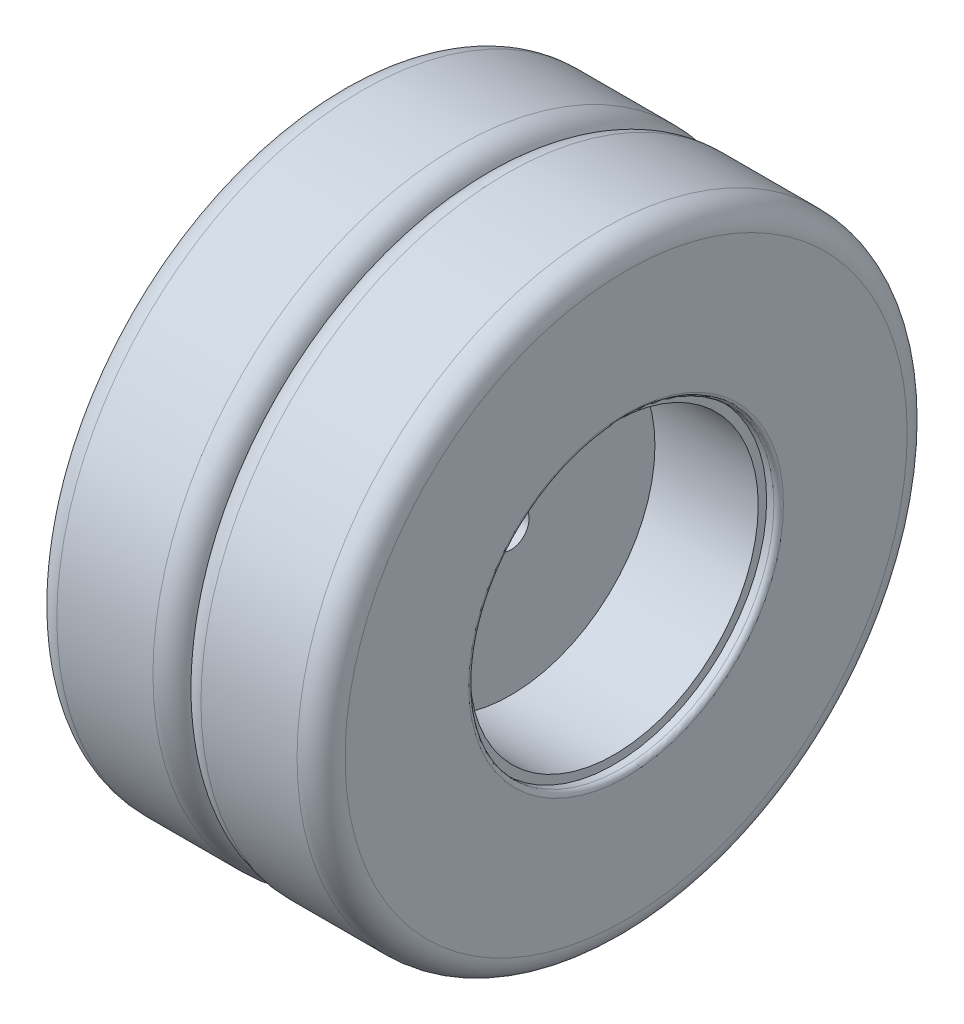
ISO-10303-21;
HEADER;
FILE_DESCRIPTION(('STEP AP214'),'2;1');
FILE_NAME('part.step','',(''),(''),'','','');
FILE_SCHEMA(('AUTOMOTIVE_DESIGN { 1 0 10303 214 1 1 1 1 }'));
ENDSEC;
DATA;
#1=APPLICATION_CONTEXT('core data for automotive mechanical design processes');
#2=APPLICATION_PROTOCOL_DEFINITION('international standard','automotive_design',2000,#1);
#3=PRODUCT_CONTEXT('',#1,'mechanical');
#4=PRODUCT('Part','Part','',(#3));
#5=PRODUCT_RELATED_PRODUCT_CATEGORY('part','',(#4));
#6=PRODUCT_DEFINITION_FORMATION('','',#4);
#7=PRODUCT_DEFINITION_CONTEXT('part definition',#1,'design');
#8=PRODUCT_DEFINITION('design','',#6,#7);
#9=PRODUCT_DEFINITION_SHAPE('','',#8);
#10=(LENGTH_UNIT() NAMED_UNIT(*) SI_UNIT(.MILLI.,.METRE.));
#11=(NAMED_UNIT(*) PLANE_ANGLE_UNIT() SI_UNIT($,.RADIAN.));
#12=(NAMED_UNIT(*) SI_UNIT($,.STERADIAN.) SOLID_ANGLE_UNIT());
#13=UNCERTAINTY_MEASURE_WITH_UNIT(LENGTH_MEASURE(1.E-05),#10,'distance_accuracy_value','');
#14=(GEOMETRIC_REPRESENTATION_CONTEXT(3) GLOBAL_UNCERTAINTY_ASSIGNED_CONTEXT((#13)) GLOBAL_UNIT_ASSIGNED_CONTEXT((#10,
#11,#12)) REPRESENTATION_CONTEXT('',''));
#15=CARTESIAN_POINT('',(0.,0.,0.));
#16=DIRECTION('',(0.,0.,1.));
#17=DIRECTION('',(1.,0.,0.));
#18=AXIS2_PLACEMENT_3D('',#15,#16,#17);
#19=CARTESIAN_POINT('',(-12.,0.,0.));
#20=DIRECTION('',(-1.,0.,0.));
#21=DIRECTION('',(0.,0.,-1.));
#22=AXIS2_PLACEMENT_3D('',#19,#20,#21);
#23=PLANE('',#22);
#24=CARTESIAN_POINT('',(-12.,0.,0.));
#25=DIRECTION('',(1.,0.,0.));
#26=DIRECTION('',(0.,0.,-1.));
#27=AXIS2_PLACEMENT_3D('',#24,#25,#26);
#28=CIRCLE('',#27,7.625);
#29=CARTESIAN_POINT('',(-12.,0.,-7.625));
#30=VERTEX_POINT('',#29);
#31=EDGE_CURVE('E83',#30,#30,#28,.T.);
#32=ORIENTED_EDGE('',*,*,#31,.T.);
#33=EDGE_LOOP('',(#32));
#34=FACE_BOUND('',#33,.T.);
#35=CARTESIAN_POINT('',(-12.,0.,0.));
#36=DIRECTION('',(1.,0.,0.));
#37=DIRECTION('',(0.,0.,-1.));
#38=AXIS2_PLACEMENT_3D('',#35,#36,#37);
#39=CIRCLE('',#38,60.);
#40=CARTESIAN_POINT('',(-12.,0.,-60.));
#41=VERTEX_POINT('',#40);
#42=EDGE_CURVE('E79',#41,#41,#39,.F.);
#43=ORIENTED_EDGE('',*,*,#42,.T.);
#44=EDGE_LOOP('',(#43));
#45=FACE_BOUND('',#44,.T.);
#46=ADVANCED_FACE('F47',(#34,#45),#23,.T.);
#47=CARTESIAN_POINT('',(-5.,0.,0.));
#48=DIRECTION('',(-1.,0.,0.));
#49=DIRECTION('',(0.,0.,-1.));
#50=AXIS2_PLACEMENT_3D('',#47,#48,#49);
#51=PLANE('',#50);
#52=CARTESIAN_POINT('',(-5.,0.,0.));
#53=DIRECTION('',(1.,0.,0.));
#54=DIRECTION('',(0.,0.,-1.));
#55=AXIS2_PLACEMENT_3D('',#52,#53,#54);
#56=CIRCLE('',#55,63.5);
#57=CARTESIAN_POINT('',(-5.,0.,-63.5));
#58=VERTEX_POINT('',#57);
#59=EDGE_CURVE('E80',#58,#58,#56,.T.);
#60=ORIENTED_EDGE('',*,*,#59,.T.);
#61=EDGE_LOOP('',(#60));
#62=FACE_BOUND('',#61,.T.);
#63=CARTESIAN_POINT('',(-5.,0.,0.));
#64=DIRECTION('',(1.,0.,0.));
#65=DIRECTION('',(0.,0.,-1.));
#66=AXIS2_PLACEMENT_3D('',#63,#64,#65);
#67=CIRCLE('',#66,7.625);
#68=CARTESIAN_POINT('',(-5.,0.,-7.625));
#69=VERTEX_POINT('',#68);
#70=EDGE_CURVE('E84',#69,#69,#67,.T.);
#71=ORIENTED_EDGE('',*,*,#70,.F.);
#72=EDGE_LOOP('',(#71));
#73=FACE_BOUND('',#72,.T.);
#74=ADVANCED_FACE('F124',(#62,#73),#51,.F.);
#75=CARTESIAN_POINT('',(-12.,0.,0.));
#76=DIRECTION('',(1.,0.,0.));
#77=DIRECTION('',(0.,0.,1.));
#78=AXIS2_PLACEMENT_3D('',#75,#76,#77);
#79=CYLINDRICAL_SURFACE('',#78,7.625);
#80=ORIENTED_EDGE('',*,*,#31,.F.);
#81=EDGE_LOOP('',(#80));
#82=FACE_BOUND('',#81,.T.);
#83=ORIENTED_EDGE('',*,*,#70,.T.);
#84=EDGE_LOOP('',(#83));
#85=FACE_BOUND('',#84,.T.);
#86=ADVANCED_FACE('F130',(#82,#85),#79,.F.);
#87=CARTESIAN_POINT('',(-55.,0.,0.));
#88=DIRECTION('',(-1.,0.,0.));
#89=DIRECTION('',(0.,0.,-1.));
#90=AXIS2_PLACEMENT_3D('',#87,#88,#89);
#91=PLANE('',#90);
#92=CARTESIAN_POINT('',(-55.,0.,0.));
#93=DIRECTION('',(1.,0.,0.));
#94=DIRECTION('',(0.,0.,-1.));
#95=AXIS2_PLACEMENT_3D('',#92,#93,#94);
#96=CIRCLE('',#95,63.5);
#97=CARTESIAN_POINT('',(-55.,0.,-63.5));
#98=VERTEX_POINT('',#97);
#99=EDGE_CURVE('E94',#98,#98,#96,.F.);
#100=ORIENTED_EDGE('',*,*,#99,.T.);
#101=EDGE_LOOP('',(#100));
#102=FACE_BOUND('',#101,.T.);
#103=CARTESIAN_POINT('',(-55.,0.,0.));
#104=DIRECTION('',(1.,0.,0.));
#105=DIRECTION('',(0.,0.,-1.));
#106=AXIS2_PLACEMENT_3D('',#103,#104,#105);
#107=CIRCLE('',#106,60.);
#108=CARTESIAN_POINT('',(-55.,0.,-60.));
#109=VERTEX_POINT('',#108);
#110=EDGE_CURVE('E87',#109,#109,#107,.T.);
#111=ORIENTED_EDGE('',*,*,#110,.T.);
#112=EDGE_LOOP('',(#111));
#113=FACE_BOUND('',#112,.T.);
#114=ADVANCED_FACE('F98',(#102,#113),#91,.T.);
#115=CARTESIAN_POINT('',(-55.,0.,0.));
#116=DIRECTION('',(1.,0.,0.));
#117=DIRECTION('',(0.,0.,1.));
#118=AXIS2_PLACEMENT_3D('',#115,#116,#117);
#119=CYLINDRICAL_SURFACE('',#118,60.);
#120=ORIENTED_EDGE('',*,*,#42,.F.);
#121=EDGE_LOOP('',(#120));
#122=FACE_BOUND('',#121,.T.);
#123=ORIENTED_EDGE('',*,*,#110,.F.);
#124=EDGE_LOOP('',(#123));
#125=FACE_BOUND('',#124,.T.);
#126=ADVANCED_FACE('F121',(#122,#125),#119,.F.);
#127=CARTESIAN_POINT('',(-60.,0.,0.));
#128=DIRECTION('',(1.,0.,0.));
#129=DIRECTION('',(0.,0.,1.));
#130=AXIS2_PLACEMENT_3D('',#127,#128,#129);
#131=CYLINDRICAL_SURFACE('',#130,63.5);
#132=CARTESIAN_POINT('',(-2.,0.,0.));
#133=DIRECTION('',(1.,0.,0.));
#134=DIRECTION('',(0.,0.,-1.));
#135=AXIS2_PLACEMENT_3D('',#132,#133,#134);
#136=CIRCLE('',#135,63.5);
#137=CARTESIAN_POINT('',(-2.,0.,-63.5));
#138=VERTEX_POINT('',#137);
#139=EDGE_CURVE('E58',#138,#138,#136,.F.);
#140=ORIENTED_EDGE('',*,*,#139,.F.);
#141=EDGE_LOOP('',(#140));
#142=FACE_BOUND('',#141,.T.);
#143=ORIENTED_EDGE('',*,*,#59,.F.);
#144=EDGE_LOOP('',(#143));
#145=FACE_BOUND('',#144,.T.);
#146=ADVANCED_FACE('F107',(#142,#145),#131,.F.);
#147=CARTESIAN_POINT('',(-60.,0.,0.));
#148=DIRECTION('',(-1.,0.,0.));
#149=DIRECTION('',(0.,0.,-1.));
#150=AXIS2_PLACEMENT_3D('',#147,#148,#149);
#151=PLANE('',#150);
#152=CARTESIAN_POINT('',(-60.,0.,0.));
#153=DIRECTION('',(1.,0.,0.));
#154=DIRECTION('',(0.,0.,-1.));
#155=AXIS2_PLACEMENT_3D('',#152,#153,#154);
#156=CIRCLE('',#155,65.5);
#157=CARTESIAN_POINT('',(-60.,0.,-65.5));
#158=VERTEX_POINT('',#157);
#159=EDGE_CURVE('E11',#158,#158,#156,.F.);
#160=ORIENTED_EDGE('',*,*,#159,.F.);
#161=EDGE_LOOP('',(#160));
#162=FACE_BOUND('',#161,.T.);
#163=CARTESIAN_POINT('',(-60.,0.,0.));
#164=DIRECTION('',(1.,0.,0.));
#165=DIRECTION('',(0.,0.,-1.));
#166=AXIS2_PLACEMENT_3D('',#163,#164,#165);
#167=CIRCLE('',#166,117.);
#168=CARTESIAN_POINT('',(-60.,0.,-117.));
#169=VERTEX_POINT('',#168);
#170=EDGE_CURVE('E67',#169,#169,#167,.T.);
#171=ORIENTED_EDGE('',*,*,#170,.F.);
#172=EDGE_LOOP('',(#171));
#173=FACE_BOUND('',#172,.T.);
#174=ADVANCED_FACE('F120',(#162,#173),#151,.T.);
#175=CARTESIAN_POINT('',(0.,0.,0.));
#176=DIRECTION('',(-1.,0.,0.));
#177=DIRECTION('',(0.,0.,-1.));
#178=AXIS2_PLACEMENT_3D('',#175,#176,#177);
#179=PLANE('',#178);
#180=CARTESIAN_POINT('',(0.,0.,0.));
#181=DIRECTION('',(1.,0.,0.));
#182=DIRECTION('',(0.,0.,-1.));
#183=AXIS2_PLACEMENT_3D('',#180,#181,#182);
#184=CIRCLE('',#183,65.5);
#185=CARTESIAN_POINT('',(0.,0.,-65.5));
#186=VERTEX_POINT('',#185);
#187=EDGE_CURVE('E62',#186,#186,#184,.T.);
#188=ORIENTED_EDGE('',*,*,#187,.F.);
#189=EDGE_LOOP('',(#188));
#190=FACE_BOUND('',#189,.T.);
#191=CARTESIAN_POINT('',(0.,0.,0.));
#192=DIRECTION('',(1.,0.,0.));
#193=DIRECTION('',(0.,0.,-1.));
#194=AXIS2_PLACEMENT_3D('',#191,#192,#193);
#195=CIRCLE('',#194,117.);
#196=CARTESIAN_POINT('',(0.,0.,-117.));
#197=VERTEX_POINT('',#196);
#198=EDGE_CURVE('E70',#197,#197,#195,.F.);
#199=ORIENTED_EDGE('',*,*,#198,.F.);
#200=EDGE_LOOP('',(#199));
#201=FACE_BOUND('',#200,.T.);
#202=ADVANCED_FACE('F115',(#190,#201),#179,.F.);
#203=CARTESIAN_POINT('',(-60.,0.,0.));
#204=DIRECTION('',(1.,0.,0.));
#205=DIRECTION('',(0.,0.,1.));
#206=AXIS2_PLACEMENT_3D('',#203,#204,#205);
#207=CYLINDRICAL_SURFACE('',#206,127.);
#208=CARTESIAN_POINT('',(-10.,0.,0.));
#209=DIRECTION('',(1.,0.,0.));
#210=DIRECTION('',(0.,0.,-1.));
#211=AXIS2_PLACEMENT_3D('',#208,#209,#210);
#212=CIRCLE('',#211,127.);
#213=CARTESIAN_POINT('',(-10.,0.,-127.));
#214=VERTEX_POINT('',#213);
#215=EDGE_CURVE('E73',#214,#214,#212,.T.);
#216=ORIENTED_EDGE('',*,*,#215,.F.);
#217=EDGE_LOOP('',(#216));
#218=FACE_BOUND('',#217,.T.);
#219=CARTESIAN_POINT('',(-50.,0.,0.));
#220=DIRECTION('',(1.,0.,0.));
#221=DIRECTION('',(0.,0.,-1.));
#222=AXIS2_PLACEMENT_3D('',#219,#220,#221);
#223=CIRCLE('',#222,127.);
#224=CARTESIAN_POINT('',(-50.,0.,-127.));
#225=VERTEX_POINT('',#224);
#226=EDGE_CURVE('E76',#225,#225,#223,.F.);
#227=ORIENTED_EDGE('',*,*,#226,.F.);
#228=EDGE_LOOP('',(#227));
#229=FACE_BOUND('',#228,.T.);
#230=ADVANCED_FACE('F104',(#218,#229),#207,.T.);
#231=CARTESIAN_POINT('',(-58.,0.,0.));
#232=DIRECTION('',(1.,0.,0.));
#233=DIRECTION('',(0.,0.,-1.));
#234=AXIS2_PLACEMENT_3D('',#231,#232,#233);
#235=CIRCLE('',#234,63.5);
#236=CARTESIAN_POINT('',(-58.,0.,-63.5));
#237=VERTEX_POINT('',#236);
#238=EDGE_CURVE('E54',#237,#237,#235,.T.);
#239=ORIENTED_EDGE('',*,*,#238,.F.);
#240=EDGE_LOOP('',(#239));
#241=FACE_BOUND('',#240,.T.);
#242=ORIENTED_EDGE('',*,*,#99,.F.);
#243=EDGE_LOOP('',(#242));
#244=FACE_BOUND('',#243,.T.);
#245=ADVANCED_FACE('F101',(#241,#244),#131,.F.);
#246=CARTESIAN_POINT('',(-10.,0.,0.));
#247=DIRECTION('',(-1.,0.,0.));
#248=DIRECTION('',(0.,0.,-1.));
#249=AXIS2_PLACEMENT_3D('',#246,#247,#248);
#250=TOROIDAL_SURFACE('',#249,117.,10.);
#251=ORIENTED_EDGE('',*,*,#198,.T.);
#252=EDGE_LOOP('',(#251));
#253=FACE_BOUND('',#252,.T.);
#254=ORIENTED_EDGE('',*,*,#215,.T.);
#255=EDGE_LOOP('',(#254));
#256=FACE_BOUND('',#255,.T.);
#257=ADVANCED_FACE('F103',(#253,#256),#250,.T.);
#258=CARTESIAN_POINT('',(-50.,0.,0.));
#259=DIRECTION('',(-1.,0.,0.));
#260=DIRECTION('',(0.,0.,-1.));
#261=AXIS2_PLACEMENT_3D('',#258,#259,#260);
#262=TOROIDAL_SURFACE('',#261,117.,10.);
#263=ORIENTED_EDGE('',*,*,#226,.T.);
#264=EDGE_LOOP('',(#263));
#265=FACE_BOUND('',#264,.T.);
#266=ORIENTED_EDGE('',*,*,#170,.T.);
#267=EDGE_LOOP('',(#266));
#268=FACE_BOUND('',#267,.T.);
#269=ADVANCED_FACE('F112',(#265,#268),#262,.T.);
#270=CARTESIAN_POINT('',(-2.,0.,0.));
#271=DIRECTION('',(-1.,0.,0.));
#272=DIRECTION('',(0.,0.,-1.));
#273=AXIS2_PLACEMENT_3D('',#270,#271,#272);
#274=TOROIDAL_SURFACE('',#273,65.5,2.);
#275=ORIENTED_EDGE('',*,*,#139,.T.);
#276=EDGE_LOOP('',(#275));
#277=FACE_BOUND('',#276,.T.);
#278=ORIENTED_EDGE('',*,*,#187,.T.);
#279=EDGE_LOOP('',(#278));
#280=FACE_BOUND('',#279,.T.);
#281=ADVANCED_FACE('F138',(#277,#280),#274,.T.);
#282=CARTESIAN_POINT('',(-58.,0.,0.));
#283=DIRECTION('',(-1.,0.,0.));
#284=DIRECTION('',(0.,0.,-1.));
#285=AXIS2_PLACEMENT_3D('',#282,#283,#284);
#286=TOROIDAL_SURFACE('',#285,65.5,2.);
#287=ORIENTED_EDGE('',*,*,#159,.T.);
#288=EDGE_LOOP('',(#287));
#289=FACE_BOUND('',#288,.T.);
#290=ORIENTED_EDGE('',*,*,#238,.T.);
#291=EDGE_LOOP('',(#290));
#292=FACE_BOUND('',#291,.T.);
#293=ADVANCED_FACE('F49',(#289,#292),#286,.T.);
#294=CLOSED_SHELL('',(#46,#74,#86,#114,#126,#146,#174,#202,#230,#245,#257,#269,#281,#293));
#295=MANIFOLD_SOLID_BREP('B2',#294);
#296=CARTESIAN_POINT('',(12.,0.,0.));
#297=DIRECTION('',(1.,0.,0.));
#298=DIRECTION('',(0.,0.,-1.));
#299=AXIS2_PLACEMENT_3D('',#296,#297,#298);
#300=PLANE('',#299);
#301=CARTESIAN_POINT('',(12.,0.,0.));
#302=DIRECTION('',(1.,0.,0.));
#303=DIRECTION('',(0.,0.,-1.));
#304=AXIS2_PLACEMENT_3D('',#301,#302,#303);
#305=CIRCLE('',#304,7.625);
#306=CARTESIAN_POINT('',(12.,0.,-7.625));
#307=VERTEX_POINT('',#306);
#308=EDGE_CURVE('E325',#307,#307,#305,.T.);
#309=ORIENTED_EDGE('',*,*,#308,.F.);
#310=EDGE_LOOP('',(#309));
#311=FACE_BOUND('',#310,.T.);
#312=CARTESIAN_POINT('',(12.,0.,0.));
#313=DIRECTION('',(1.,0.,0.));
#314=DIRECTION('',(0.,0.,-1.));
#315=AXIS2_PLACEMENT_3D('',#312,#313,#314);
#316=CIRCLE('',#315,60.);
#317=CARTESIAN_POINT('',(12.,0.,-60.));
#318=VERTEX_POINT('',#317);
#319=EDGE_CURVE('E321',#318,#318,#316,.F.);
#320=ORIENTED_EDGE('',*,*,#319,.F.);
#321=EDGE_LOOP('',(#320));
#322=FACE_BOUND('',#321,.T.);
#323=ADVANCED_FACE('F289',(#311,#322),#300,.T.);
#324=CARTESIAN_POINT('',(5.,0.,0.));
#325=DIRECTION('',(1.,0.,0.));
#326=DIRECTION('',(0.,0.,-1.));
#327=AXIS2_PLACEMENT_3D('',#324,#325,#326);
#328=PLANE('',#327);
#329=CARTESIAN_POINT('',(5.,0.,0.));
#330=DIRECTION('',(1.,0.,0.));
#331=DIRECTION('',(0.,0.,-1.));
#332=AXIS2_PLACEMENT_3D('',#329,#330,#331);
#333=CIRCLE('',#332,63.5);
#334=CARTESIAN_POINT('',(5.,0.,-63.5));
#335=VERTEX_POINT('',#334);
#336=EDGE_CURVE('E322',#335,#335,#333,.T.);
#337=ORIENTED_EDGE('',*,*,#336,.F.);
#338=EDGE_LOOP('',(#337));
#339=FACE_BOUND('',#338,.T.);
#340=CARTESIAN_POINT('',(5.,0.,0.));
#341=DIRECTION('',(1.,0.,0.));
#342=DIRECTION('',(0.,0.,-1.));
#343=AXIS2_PLACEMENT_3D('',#340,#341,#342);
#344=CIRCLE('',#343,7.625);
#345=CARTESIAN_POINT('',(5.,0.,-7.625));
#346=VERTEX_POINT('',#345);
#347=EDGE_CURVE('E326',#346,#346,#344,.T.);
#348=ORIENTED_EDGE('',*,*,#347,.T.);
#349=EDGE_LOOP('',(#348));
#350=FACE_BOUND('',#349,.T.);
#351=ADVANCED_FACE('F362',(#339,#350),#328,.F.);
#352=CARTESIAN_POINT('',(12.,0.,0.));
#353=DIRECTION('',(-1.,0.,0.));
#354=DIRECTION('',(0.,0.,1.));
#355=AXIS2_PLACEMENT_3D('',#352,#353,#354);
#356=CYLINDRICAL_SURFACE('',#355,7.625);
#357=ORIENTED_EDGE('',*,*,#308,.T.);
#358=EDGE_LOOP('',(#357));
#359=FACE_BOUND('',#358,.T.);
#360=ORIENTED_EDGE('',*,*,#347,.F.);
#361=EDGE_LOOP('',(#360));
#362=FACE_BOUND('',#361,.T.);
#363=ADVANCED_FACE('F346',(#359,#362),#356,.F.);
#364=CARTESIAN_POINT('',(55.,0.,0.));
#365=DIRECTION('',(1.,0.,0.));
#366=DIRECTION('',(0.,0.,-1.));
#367=AXIS2_PLACEMENT_3D('',#364,#365,#366);
#368=PLANE('',#367);
#369=CARTESIAN_POINT('',(55.,0.,0.));
#370=DIRECTION('',(1.,0.,0.));
#371=DIRECTION('',(0.,0.,-1.));
#372=AXIS2_PLACEMENT_3D('',#369,#370,#371);
#373=CIRCLE('',#372,63.5);
#374=CARTESIAN_POINT('',(55.,0.,-63.5));
#375=VERTEX_POINT('',#374);
#376=EDGE_CURVE('E336',#375,#375,#373,.F.);
#377=ORIENTED_EDGE('',*,*,#376,.F.);
#378=EDGE_LOOP('',(#377));
#379=FACE_BOUND('',#378,.T.);
#380=CARTESIAN_POINT('',(55.,0.,0.));
#381=DIRECTION('',(1.,0.,0.));
#382=DIRECTION('',(0.,0.,-1.));
#383=AXIS2_PLACEMENT_3D('',#380,#381,#382);
#384=CIRCLE('',#383,60.);
#385=CARTESIAN_POINT('',(55.,0.,-60.));
#386=VERTEX_POINT('',#385);
#387=EDGE_CURVE('E329',#386,#386,#384,.T.);
#388=ORIENTED_EDGE('',*,*,#387,.F.);
#389=EDGE_LOOP('',(#388));
#390=FACE_BOUND('',#389,.T.);
#391=ADVANCED_FACE('F342',(#379,#390),#368,.T.);
#392=CARTESIAN_POINT('',(55.,0.,0.));
#393=DIRECTION('',(-1.,0.,0.));
#394=DIRECTION('',(0.,0.,1.));
#395=AXIS2_PLACEMENT_3D('',#392,#393,#394);
#396=CYLINDRICAL_SURFACE('',#395,60.);
#397=ORIENTED_EDGE('',*,*,#319,.T.);
#398=EDGE_LOOP('',(#397));
#399=FACE_BOUND('',#398,.T.);
#400=ORIENTED_EDGE('',*,*,#387,.T.);
#401=EDGE_LOOP('',(#400));
#402=FACE_BOUND('',#401,.T.);
#403=ADVANCED_FACE('F345',(#399,#402),#396,.F.);
#404=CARTESIAN_POINT('',(60.,0.,0.));
#405=DIRECTION('',(-1.,0.,0.));
#406=DIRECTION('',(0.,0.,1.));
#407=AXIS2_PLACEMENT_3D('',#404,#405,#406);
#408=CYLINDRICAL_SURFACE('',#407,63.5);
#409=CARTESIAN_POINT('',(2.,0.,0.));
#410=DIRECTION('',(1.,0.,0.));
#411=DIRECTION('',(0.,0.,-1.));
#412=AXIS2_PLACEMENT_3D('',#409,#410,#411);
#413=CIRCLE('',#412,63.5);
#414=CARTESIAN_POINT('',(2.,0.,-63.5));
#415=VERTEX_POINT('',#414);
#416=EDGE_CURVE('E300',#415,#415,#413,.F.);
#417=ORIENTED_EDGE('',*,*,#416,.T.);
#418=EDGE_LOOP('',(#417));
#419=FACE_BOUND('',#418,.T.);
#420=ORIENTED_EDGE('',*,*,#336,.T.);
#421=EDGE_LOOP('',(#420));
#422=FACE_BOUND('',#421,.T.);
#423=ADVANCED_FACE('F351',(#419,#422),#408,.F.);
#424=CARTESIAN_POINT('',(60.,0.,0.));
#425=DIRECTION('',(1.,0.,0.));
#426=DIRECTION('',(0.,0.,-1.));
#427=AXIS2_PLACEMENT_3D('',#424,#425,#426);
#428=PLANE('',#427);
#429=CARTESIAN_POINT('',(60.,0.,0.));
#430=DIRECTION('',(1.,0.,0.));
#431=DIRECTION('',(0.,0.,-1.));
#432=AXIS2_PLACEMENT_3D('',#429,#430,#431);
#433=CIRCLE('',#432,65.5);
#434=CARTESIAN_POINT('',(60.,0.,-65.5));
#435=VERTEX_POINT('',#434);
#436=EDGE_CURVE('E46',#435,#435,#433,.F.);
#437=ORIENTED_EDGE('',*,*,#436,.T.);
#438=EDGE_LOOP('',(#437));
#439=FACE_BOUND('',#438,.T.);
#440=CARTESIAN_POINT('',(60.,0.,0.));
#441=DIRECTION('',(1.,0.,0.));
#442=DIRECTION('',(0.,0.,-1.));
#443=AXIS2_PLACEMENT_3D('',#440,#441,#442);
#444=CIRCLE('',#443,117.);
#445=CARTESIAN_POINT('',(60.,0.,-117.));
#446=VERTEX_POINT('',#445);
#447=EDGE_CURVE('E309',#446,#446,#444,.T.);
#448=ORIENTED_EDGE('',*,*,#447,.T.);
#449=EDGE_LOOP('',(#448));
#450=FACE_BOUND('',#449,.T.);
#451=ADVANCED_FACE('F357',(#439,#450),#428,.T.);
#452=CARTESIAN_POINT('',(0.,0.,0.));
#453=DIRECTION('',(1.,0.,0.));
#454=DIRECTION('',(0.,0.,-1.));
#455=AXIS2_PLACEMENT_3D('',#452,#453,#454);
#456=PLANE('',#455);
#457=CARTESIAN_POINT('',(0.,0.,0.));
#458=DIRECTION('',(1.,0.,0.));
#459=DIRECTION('',(0.,0.,-1.));
#460=AXIS2_PLACEMENT_3D('',#457,#458,#459);
#461=CIRCLE('',#460,65.5);
#462=CARTESIAN_POINT('',(0.,0.,-65.5));
#463=VERTEX_POINT('',#462);
#464=EDGE_CURVE('E304',#463,#463,#461,.T.);
#465=ORIENTED_EDGE('',*,*,#464,.T.);
#466=EDGE_LOOP('',(#465));
#467=FACE_BOUND('',#466,.T.);
#468=CARTESIAN_POINT('',(0.,0.,0.));
#469=DIRECTION('',(1.,0.,0.));
#470=DIRECTION('',(0.,0.,-1.));
#471=AXIS2_PLACEMENT_3D('',#468,#469,#470);
#472=CIRCLE('',#471,117.);
#473=CARTESIAN_POINT('',(0.,0.,-117.));
#474=VERTEX_POINT('',#473);
#475=EDGE_CURVE('E312',#474,#474,#472,.F.);
#476=ORIENTED_EDGE('',*,*,#475,.T.);
#477=EDGE_LOOP('',(#476));
#478=FACE_BOUND('',#477,.T.);
#479=ADVANCED_FACE('F392',(#467,#478),#456,.F.);
#480=CARTESIAN_POINT('',(60.,0.,0.));
#481=DIRECTION('',(-1.,0.,0.));
#482=DIRECTION('',(0.,0.,1.));
#483=AXIS2_PLACEMENT_3D('',#480,#481,#482);
#484=CYLINDRICAL_SURFACE('',#483,127.);
#485=CARTESIAN_POINT('',(10.,0.,0.));
#486=DIRECTION('',(1.,0.,0.));
#487=DIRECTION('',(0.,0.,-1.));
#488=AXIS2_PLACEMENT_3D('',#485,#486,#487);
#489=CIRCLE('',#488,127.);
#490=CARTESIAN_POINT('',(10.,0.,-127.));
#491=VERTEX_POINT('',#490);
#492=EDGE_CURVE('E315',#491,#491,#489,.T.);
#493=ORIENTED_EDGE('',*,*,#492,.T.);
#494=EDGE_LOOP('',(#493));
#495=FACE_BOUND('',#494,.T.);
#496=CARTESIAN_POINT('',(50.,0.,0.));
#497=DIRECTION('',(1.,0.,0.));
#498=DIRECTION('',(0.,0.,-1.));
#499=AXIS2_PLACEMENT_3D('',#496,#497,#498);
#500=CIRCLE('',#499,127.);
#501=CARTESIAN_POINT('',(50.,0.,-127.));
#502=VERTEX_POINT('',#501);
#503=EDGE_CURVE('E318',#502,#502,#500,.F.);
#504=ORIENTED_EDGE('',*,*,#503,.T.);
#505=EDGE_LOOP('',(#504));
#506=FACE_BOUND('',#505,.T.);
#507=ADVANCED_FACE('F395',(#495,#506),#484,.T.);
#508=CARTESIAN_POINT('',(58.,0.,0.));
#509=DIRECTION('',(1.,0.,0.));
#510=DIRECTION('',(0.,0.,-1.));
#511=AXIS2_PLACEMENT_3D('',#508,#509,#510);
#512=CIRCLE('',#511,63.5);
#513=CARTESIAN_POINT('',(58.,0.,-63.5));
#514=VERTEX_POINT('',#513);
#515=EDGE_CURVE('E296',#514,#514,#512,.T.);
#516=ORIENTED_EDGE('',*,*,#515,.T.);
#517=EDGE_LOOP('',(#516));
#518=FACE_BOUND('',#517,.T.);
#519=ORIENTED_EDGE('',*,*,#376,.T.);
#520=EDGE_LOOP('',(#519));
#521=FACE_BOUND('',#520,.T.);
#522=ADVANCED_FACE('F340',(#518,#521),#408,.F.);
#523=CARTESIAN_POINT('',(10.,0.,0.));
#524=DIRECTION('',(1.,0.,0.));
#525=DIRECTION('',(0.,0.,-1.));
#526=AXIS2_PLACEMENT_3D('',#523,#524,#525);
#527=TOROIDAL_SURFACE('',#526,117.,10.);
#528=ORIENTED_EDGE('',*,*,#475,.F.);
#529=EDGE_LOOP('',(#528));
#530=FACE_BOUND('',#529,.T.);
#531=ORIENTED_EDGE('',*,*,#492,.F.);
#532=EDGE_LOOP('',(#531));
#533=FACE_BOUND('',#532,.T.);
#534=ADVANCED_FACE('F374',(#530,#533),#527,.T.);
#535=CARTESIAN_POINT('',(50.,0.,0.));
#536=DIRECTION('',(1.,0.,0.));
#537=DIRECTION('',(0.,0.,-1.));
#538=AXIS2_PLACEMENT_3D('',#535,#536,#537);
#539=TOROIDAL_SURFACE('',#538,117.,10.);
#540=ORIENTED_EDGE('',*,*,#503,.F.);
#541=EDGE_LOOP('',(#540));
#542=FACE_BOUND('',#541,.T.);
#543=ORIENTED_EDGE('',*,*,#447,.F.);
#544=EDGE_LOOP('',(#543));
#545=FACE_BOUND('',#544,.T.);
#546=ADVANCED_FACE('F377',(#542,#545),#539,.T.);
#547=CARTESIAN_POINT('',(2.,0.,0.));
#548=DIRECTION('',(1.,0.,0.));
#549=DIRECTION('',(0.,0.,-1.));
#550=AXIS2_PLACEMENT_3D('',#547,#548,#549);
#551=TOROIDAL_SURFACE('',#550,65.5,2.);
#552=ORIENTED_EDGE('',*,*,#416,.F.);
#553=EDGE_LOOP('',(#552));
#554=FACE_BOUND('',#553,.T.);
#555=ORIENTED_EDGE('',*,*,#464,.F.);
#556=EDGE_LOOP('',(#555));
#557=FACE_BOUND('',#556,.T.);
#558=ADVANCED_FACE('F380',(#554,#557),#551,.T.);
#559=CARTESIAN_POINT('',(58.,0.,0.));
#560=DIRECTION('',(1.,0.,0.));
#561=DIRECTION('',(0.,0.,-1.));
#562=AXIS2_PLACEMENT_3D('',#559,#560,#561);
#563=TOROIDAL_SURFACE('',#562,65.5,2.);
#564=ORIENTED_EDGE('',*,*,#436,.F.);
#565=EDGE_LOOP('',(#564));
#566=FACE_BOUND('',#565,.T.);
#567=ORIENTED_EDGE('',*,*,#515,.F.);
#568=EDGE_LOOP('',(#567));
#569=FACE_BOUND('',#568,.T.);
#570=ADVANCED_FACE('F291',(#566,#569),#563,.T.);
#571=CLOSED_SHELL('',(#323,#351,#363,#391,#403,#423,#451,#479,#507,#522,#534,#546,#558,#570));
#572=MANIFOLD_SOLID_BREP('B6_NOT_SHOWN',#571);
#573=ADVANCED_BREP_SHAPE_REPRESENTATION('',(#18,#295,#572),#14);
#574=SHAPE_DEFINITION_REPRESENTATION(#9,#573);
ENDSEC;
END-ISO-10303-21;
